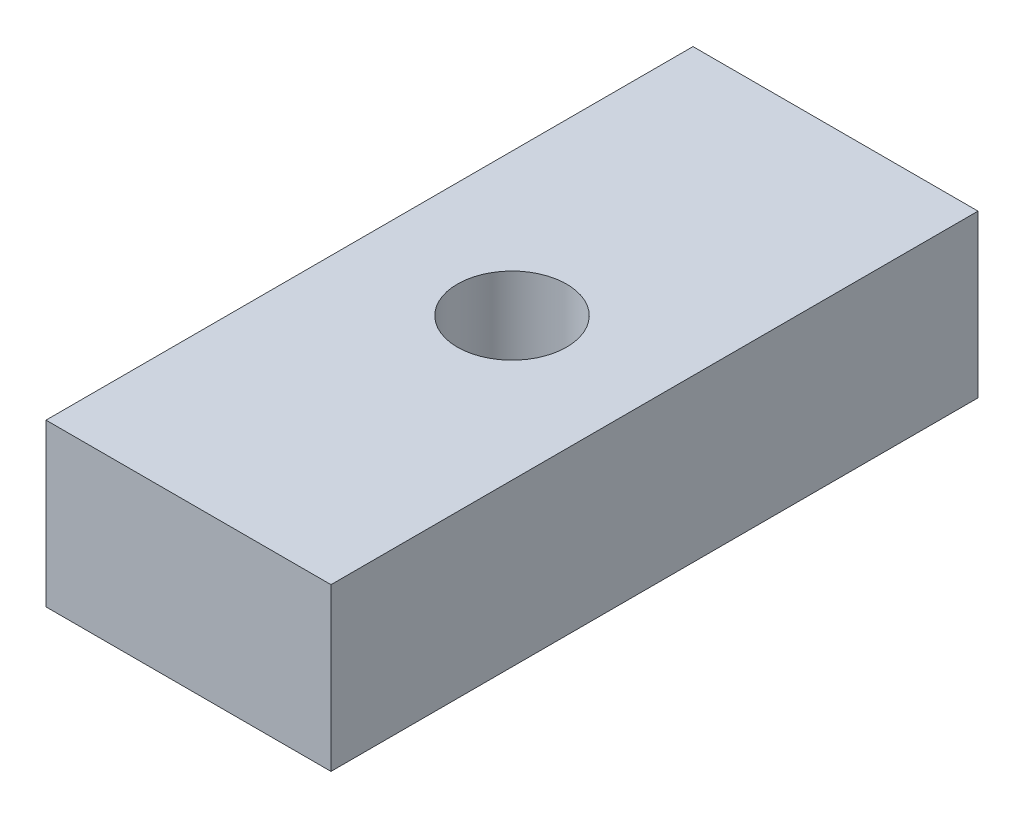
ISO-10303-21;
HEADER;
FILE_DESCRIPTION(('STEP AP214'),'2;1');
FILE_NAME('part.step','',(''),(''),'','','');
FILE_SCHEMA(('AUTOMOTIVE_DESIGN { 1 0 10303 214 1 1 1 1 }'));
ENDSEC;
DATA;
#1=APPLICATION_CONTEXT('core data for automotive mechanical design processes');
#2=APPLICATION_PROTOCOL_DEFINITION('international standard','automotive_design',2000,#1);
#3=PRODUCT_CONTEXT('',#1,'mechanical');
#4=PRODUCT('Part','Part','',(#3));
#5=PRODUCT_RELATED_PRODUCT_CATEGORY('part','',(#4));
#6=PRODUCT_DEFINITION_FORMATION('','',#4);
#7=PRODUCT_DEFINITION_CONTEXT('part definition',#1,'design');
#8=PRODUCT_DEFINITION('design','',#6,#7);
#9=PRODUCT_DEFINITION_SHAPE('','',#8);
#10=(LENGTH_UNIT() NAMED_UNIT(*) SI_UNIT(.MILLI.,.METRE.));
#11=(NAMED_UNIT(*) PLANE_ANGLE_UNIT() SI_UNIT($,.RADIAN.));
#12=(NAMED_UNIT(*) SI_UNIT($,.STERADIAN.) SOLID_ANGLE_UNIT());
#13=UNCERTAINTY_MEASURE_WITH_UNIT(LENGTH_MEASURE(1.E-05),#10,'distance_accuracy_value','');
#14=(GEOMETRIC_REPRESENTATION_CONTEXT(3) GLOBAL_UNCERTAINTY_ASSIGNED_CONTEXT((#13)) GLOBAL_UNIT_ASSIGNED_CONTEXT((#10,
#11,#12)) REPRESENTATION_CONTEXT('',''));
#15=CARTESIAN_POINT('',(0.,0.,0.));
#16=DIRECTION('',(0.,0.,1.));
#17=DIRECTION('',(1.,0.,0.));
#18=AXIS2_PLACEMENT_3D('',#15,#16,#17);
#19=CARTESIAN_POINT('',(0.,0.,0.));
#20=DIRECTION('',(0.,1.,0.));
#21=DIRECTION('',(0.,0.,1.));
#22=AXIS2_PLACEMENT_3D('',#19,#20,#21);
#23=PLANE('',#22);
#24=DIRECTION('',(0.,0.,-1.));
#25=VECTOR('',#24,1.);
#26=CARTESIAN_POINT('',(8.809375,0.,-20.));
#27=LINE('',#26,#25);
#28=CARTESIAN_POINT('',(8.809375,0.,20.));
#29=VERTEX_POINT('',#28);
#30=CARTESIAN_POINT('',(8.809375,0.,-20.));
#31=VERTEX_POINT('',#30);
#32=EDGE_CURVE('E109',#29,#31,#27,.T.);
#33=ORIENTED_EDGE('',*,*,#32,.F.);
#34=DIRECTION('',(1.,0.,0.));
#35=VECTOR('',#34,1.);
#36=CARTESIAN_POINT('',(-8.809375,0.,20.));
#37=LINE('',#36,#35);
#38=CARTESIAN_POINT('',(-8.809375,0.,20.));
#39=VERTEX_POINT('',#38);
#40=EDGE_CURVE('E85',#39,#29,#37,.T.);
#41=ORIENTED_EDGE('',*,*,#40,.F.);
#42=DIRECTION('',(0.,0.,1.));
#43=VECTOR('',#42,1.);
#44=CARTESIAN_POINT('',(-8.809375,0.,-20.));
#45=LINE('',#44,#43);
#46=CARTESIAN_POINT('',(-8.809375,0.,-20.));
#47=VERTEX_POINT('',#46);
#48=EDGE_CURVE('E79',#47,#39,#45,.T.);
#49=ORIENTED_EDGE('',*,*,#48,.F.);
#50=DIRECTION('',(-1.,0.,0.));
#51=VECTOR('',#50,1.);
#52=CARTESIAN_POINT('',(-8.809375,0.,-20.));
#53=LINE('',#52,#51);
#54=EDGE_CURVE('E101',#31,#47,#53,.T.);
#55=ORIENTED_EDGE('',*,*,#54,.F.);
#56=EDGE_LOOP('',(#33,#41,#49,#55));
#57=FACE_BOUND('',#56,.T.);
#58=CARTESIAN_POINT('',(0.,0.,0.));
#59=DIRECTION('',(0.,1.,0.));
#60=DIRECTION('',(0.,0.,1.));
#61=AXIS2_PLACEMENT_3D('',#58,#59,#60);
#62=CIRCLE('',#61,3.3782);
#63=CARTESIAN_POINT('',(0.,0.,3.3782));
#64=VERTEX_POINT('',#63);
#65=EDGE_CURVE('E112',#64,#64,#62,.F.);
#66=ORIENTED_EDGE('',*,*,#65,.F.);
#67=EDGE_LOOP('',(#66));
#68=FACE_BOUND('',#67,.T.);
#69=ADVANCED_FACE('F45',(#57,#68),#23,.F.);
#70=CARTESIAN_POINT('',(8.809375,10.,-20.));
#71=DIRECTION('',(-1.,0.,0.));
#72=DIRECTION('',(0.,0.,1.));
#73=AXIS2_PLACEMENT_3D('',#70,#71,#72);
#74=PLANE('',#73);
#75=ORIENTED_EDGE('',*,*,#32,.T.);
#76=DIRECTION('',(0.,-1.,0.));
#77=VECTOR('',#76,1.);
#78=CARTESIAN_POINT('',(8.809375,10.,-20.));
#79=LINE('',#78,#77);
#80=CARTESIAN_POINT('',(8.809375,10.,-20.));
#81=VERTEX_POINT('',#80);
#82=EDGE_CURVE('E11',#81,#31,#79,.T.);
#83=ORIENTED_EDGE('',*,*,#82,.F.);
#84=DIRECTION('',(0.,0.,-1.));
#85=VECTOR('',#84,1.);
#86=CARTESIAN_POINT('',(8.809375,10.,-20.));
#87=LINE('',#86,#85);
#88=CARTESIAN_POINT('',(8.809375,10.,20.));
#89=VERTEX_POINT('',#88);
#90=EDGE_CURVE('E97',#89,#81,#87,.T.);
#91=ORIENTED_EDGE('',*,*,#90,.F.);
#92=DIRECTION('',(0.,-1.,0.));
#93=VECTOR('',#92,1.);
#94=CARTESIAN_POINT('',(8.809375,10.,20.));
#95=LINE('',#94,#93);
#96=EDGE_CURVE('E105',#89,#29,#95,.T.);
#97=ORIENTED_EDGE('',*,*,#96,.T.);
#98=EDGE_LOOP('',(#75,#83,#91,#97));
#99=FACE_BOUND('',#98,.T.);
#100=ADVANCED_FACE('F47',(#99),#74,.F.);
#101=CARTESIAN_POINT('',(-8.809375,10.,-20.));
#102=DIRECTION('',(0.,0.,1.));
#103=DIRECTION('',(1.,0.,0.));
#104=AXIS2_PLACEMENT_3D('',#101,#102,#103);
#105=PLANE('',#104);
#106=ORIENTED_EDGE('',*,*,#54,.T.);
#107=DIRECTION('',(0.,-1.,0.));
#108=VECTOR('',#107,1.);
#109=CARTESIAN_POINT('',(-8.809375,10.,-20.));
#110=LINE('',#109,#108);
#111=CARTESIAN_POINT('',(-8.809375,10.,-20.));
#112=VERTEX_POINT('',#111);
#113=EDGE_CURVE('E54',#112,#47,#110,.T.);
#114=ORIENTED_EDGE('',*,*,#113,.F.);
#115=DIRECTION('',(-1.,0.,0.));
#116=VECTOR('',#115,1.);
#117=CARTESIAN_POINT('',(-8.809375,10.,-20.));
#118=LINE('',#117,#116);
#119=EDGE_CURVE('E92',#81,#112,#118,.T.);
#120=ORIENTED_EDGE('',*,*,#119,.F.);
#121=ORIENTED_EDGE('',*,*,#82,.T.);
#122=EDGE_LOOP('',(#106,#114,#120,#121));
#123=FACE_BOUND('',#122,.T.);
#124=ADVANCED_FACE('F100',(#123),#105,.F.);
#125=CARTESIAN_POINT('',(-8.809375,10.,-20.));
#126=DIRECTION('',(1.,0.,0.));
#127=DIRECTION('',(0.,0.,-1.));
#128=AXIS2_PLACEMENT_3D('',#125,#126,#127);
#129=PLANE('',#128);
#130=ORIENTED_EDGE('',*,*,#48,.T.);
#131=DIRECTION('',(0.,-1.,0.));
#132=VECTOR('',#131,1.);
#133=CARTESIAN_POINT('',(-8.809375,10.,20.));
#134=LINE('',#133,#132);
#135=CARTESIAN_POINT('',(-8.809375,10.,20.));
#136=VERTEX_POINT('',#135);
#137=EDGE_CURVE('E102',#136,#39,#134,.T.);
#138=ORIENTED_EDGE('',*,*,#137,.F.);
#139=DIRECTION('',(0.,0.,1.));
#140=VECTOR('',#139,1.);
#141=CARTESIAN_POINT('',(-8.809375,10.,-20.));
#142=LINE('',#141,#140);
#143=EDGE_CURVE('E95',#112,#136,#142,.T.);
#144=ORIENTED_EDGE('',*,*,#143,.F.);
#145=ORIENTED_EDGE('',*,*,#113,.T.);
#146=EDGE_LOOP('',(#130,#138,#144,#145));
#147=FACE_BOUND('',#146,.T.);
#148=ADVANCED_FACE('F103',(#147),#129,.F.);
#149=CARTESIAN_POINT('',(-8.809375,10.,20.));
#150=DIRECTION('',(0.,0.,-1.));
#151=DIRECTION('',(-1.,0.,0.));
#152=AXIS2_PLACEMENT_3D('',#149,#150,#151);
#153=PLANE('',#152);
#154=ORIENTED_EDGE('',*,*,#40,.T.);
#155=ORIENTED_EDGE('',*,*,#96,.F.);
#156=DIRECTION('',(1.,0.,0.));
#157=VECTOR('',#156,1.);
#158=CARTESIAN_POINT('',(-8.809375,10.,20.));
#159=LINE('',#158,#157);
#160=EDGE_CURVE('E62',#136,#89,#159,.T.);
#161=ORIENTED_EDGE('',*,*,#160,.F.);
#162=ORIENTED_EDGE('',*,*,#137,.T.);
#163=EDGE_LOOP('',(#154,#155,#161,#162));
#164=FACE_BOUND('',#163,.T.);
#165=ADVANCED_FACE('F117',(#164),#153,.F.);
#166=CARTESIAN_POINT('',(0.,10.,0.));
#167=DIRECTION('',(0.,1.,0.));
#168=DIRECTION('',(0.,0.,1.));
#169=AXIS2_PLACEMENT_3D('',#166,#167,#168);
#170=PLANE('',#169);
#171=CARTESIAN_POINT('',(0.,10.,0.));
#172=DIRECTION('',(0.,1.,0.));
#173=DIRECTION('',(0.,0.,1.));
#174=AXIS2_PLACEMENT_3D('',#171,#172,#173);
#175=CIRCLE('',#174,3.3782);
#176=CARTESIAN_POINT('',(0.,10.,3.3782));
#177=VERTEX_POINT('',#176);
#178=EDGE_CURVE('E123',#177,#177,#175,.T.);
#179=ORIENTED_EDGE('',*,*,#178,.F.);
#180=EDGE_LOOP('',(#179));
#181=FACE_BOUND('',#180,.T.);
#182=ORIENTED_EDGE('',*,*,#90,.T.);
#183=ORIENTED_EDGE('',*,*,#119,.T.);
#184=ORIENTED_EDGE('',*,*,#143,.T.);
#185=ORIENTED_EDGE('',*,*,#160,.T.);
#186=EDGE_LOOP('',(#182,#183,#184,#185));
#187=FACE_BOUND('',#186,.T.);
#188=ADVANCED_FACE('F93',(#181,#187),#170,.T.);
#189=CARTESIAN_POINT('',(0.,10.,0.));
#190=DIRECTION('',(0.,1.,0.));
#191=DIRECTION('',(0.,0.,1.));
#192=AXIS2_PLACEMENT_3D('',#189,#190,#191);
#193=CYLINDRICAL_SURFACE('',#192,3.3782);
#194=ORIENTED_EDGE('',*,*,#65,.T.);
#195=EDGE_LOOP('',(#194));
#196=FACE_BOUND('',#195,.T.);
#197=ORIENTED_EDGE('',*,*,#178,.T.);
#198=EDGE_LOOP('',(#197));
#199=FACE_BOUND('',#198,.T.);
#200=ADVANCED_FACE('F129',(#196,#199),#193,.F.);
#201=CLOSED_SHELL('',(#69,#100,#124,#148,#165,#188,#200));
#202=MANIFOLD_SOLID_BREP('B2',#201);
#203=ADVANCED_BREP_SHAPE_REPRESENTATION('',(#18,#202),#14);
#204=SHAPE_DEFINITION_REPRESENTATION(#9,#203);
ENDSEC;
END-ISO-10303-21;
